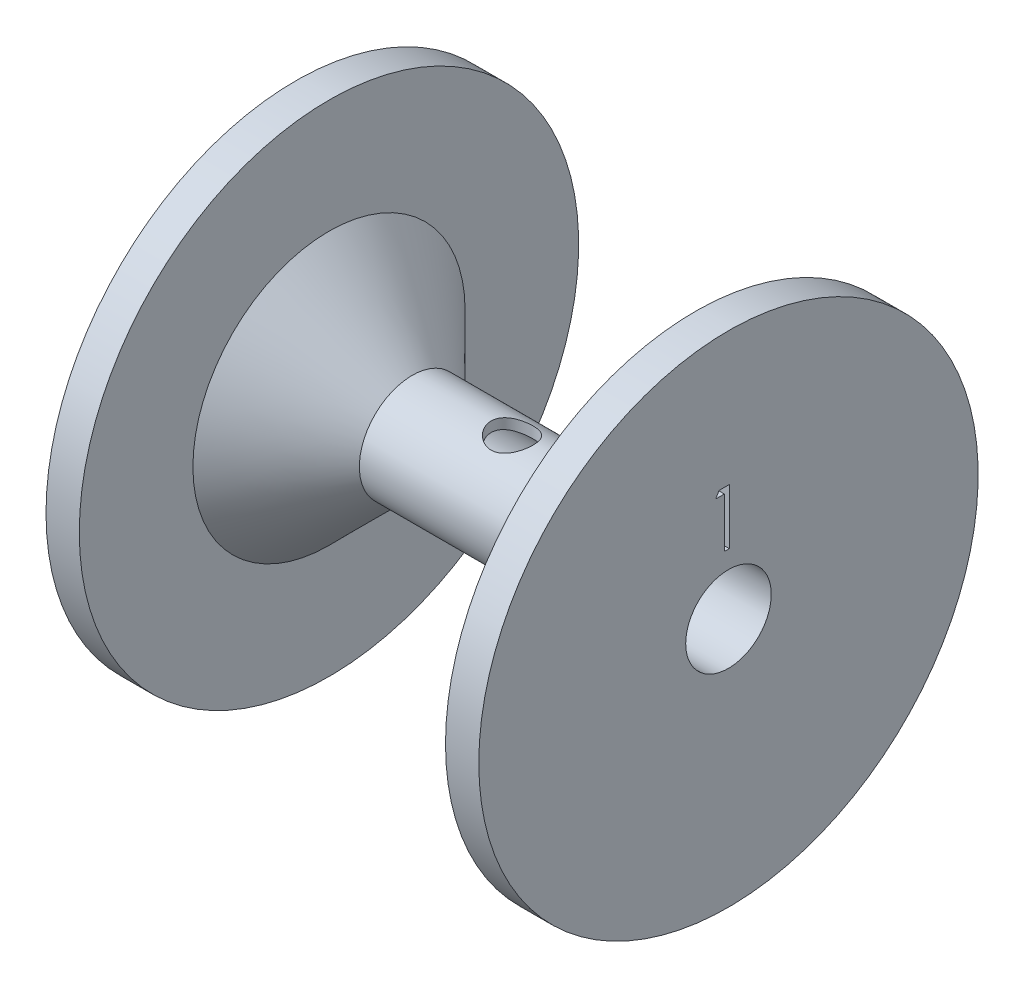
ISO-10303-21;
HEADER;
FILE_DESCRIPTION(('STEP AP214'),'2;1');
FILE_NAME('part.step','',(''),(''),'','','');
FILE_SCHEMA(('AUTOMOTIVE_DESIGN { 1 0 10303 214 1 1 1 1 }'));
ENDSEC;
DATA;
#1=APPLICATION_CONTEXT('core data for automotive mechanical design processes');
#2=APPLICATION_PROTOCOL_DEFINITION('international standard','automotive_design',2000,#1);
#3=PRODUCT_CONTEXT('',#1,'mechanical');
#4=PRODUCT('Part','Part','',(#3));
#5=PRODUCT_RELATED_PRODUCT_CATEGORY('part','',(#4));
#6=PRODUCT_DEFINITION_FORMATION('','',#4);
#7=PRODUCT_DEFINITION_CONTEXT('part definition',#1,'design');
#8=PRODUCT_DEFINITION('design','',#6,#7);
#9=PRODUCT_DEFINITION_SHAPE('','',#8);
#10=(LENGTH_UNIT() NAMED_UNIT(*) SI_UNIT(.MILLI.,.METRE.));
#11=(NAMED_UNIT(*) PLANE_ANGLE_UNIT() SI_UNIT($,.RADIAN.));
#12=(NAMED_UNIT(*) SI_UNIT($,.STERADIAN.) SOLID_ANGLE_UNIT());
#13=UNCERTAINTY_MEASURE_WITH_UNIT(LENGTH_MEASURE(1.E-05),#10,'distance_accuracy_value','');
#14=(GEOMETRIC_REPRESENTATION_CONTEXT(3) GLOBAL_UNCERTAINTY_ASSIGNED_CONTEXT((#13)) GLOBAL_UNIT_ASSIGNED_CONTEXT((#10,
#11,#12)) REPRESENTATION_CONTEXT('',''));
#15=CARTESIAN_POINT('',(0.,0.,0.));
#16=DIRECTION('',(0.,0.,1.));
#17=DIRECTION('',(1.,0.,0.));
#18=AXIS2_PLACEMENT_3D('',#15,#16,#17);
#19=CARTESIAN_POINT('',(16.51,0.,0.));
#20=DIRECTION('',(1.,0.,0.));
#21=DIRECTION('',(0.,0.,-1.));
#22=AXIS2_PLACEMENT_3D('',#19,#20,#21);
#23=PLANE('',#22);
#24=CARTESIAN_POINT('',(16.51,0.,0.));
#25=DIRECTION('',(-1.,0.,0.));
#26=DIRECTION('',(0.,0.,1.));
#27=AXIS2_PLACEMENT_3D('',#24,#25,#26);
#28=CIRCLE('',#27,3.2639);
#29=CARTESIAN_POINT('',(16.51,0.,3.2639));
#30=VERTEX_POINT('',#29);
#31=EDGE_CURVE('E266',#30,#30,#28,.T.);
#32=ORIENTED_EDGE('',*,*,#31,.T.);
#33=EDGE_LOOP('',(#32));
#34=FACE_BOUND('',#33,.T.);
#35=CARTESIAN_POINT('',(16.51,0.,0.));
#36=DIRECTION('',(-1.,0.,0.));
#37=DIRECTION('',(0.,0.,1.));
#38=AXIS2_PLACEMENT_3D('',#35,#36,#37);
#39=CIRCLE('',#38,19.05);
#40=CARTESIAN_POINT('',(16.51,0.,19.05));
#41=VERTEX_POINT('',#40);
#42=EDGE_CURVE('E262',#41,#41,#39,.T.);
#43=ORIENTED_EDGE('',*,*,#42,.F.);
#44=EDGE_LOOP('',(#43));
#45=FACE_BOUND('',#44,.T.);
#46=DIRECTION('',(0.,0.,1.));
#47=VECTOR('',#46,1.);
#48=CARTESIAN_POINT('',(16.51,8.4171758849921,0.317947080590759));
#49=LINE('',#48,#47);
#50=CARTESIAN_POINT('',(16.51,8.4171758849921,0.317947080590759));
#51=VERTEX_POINT('',#50);
#52=CARTESIAN_POINT('',(16.51,8.4171758849921,0.96922913187281));
#53=VERTEX_POINT('',#52);
#54=EDGE_CURVE('E161',#51,#53,#49,.T.);
#55=ORIENTED_EDGE('',*,*,#54,.T.);
#56=DIRECTION('',(0.,0.867930013859708,-0.496686511837686));
#57=VECTOR('',#56,1.);
#58=CARTESIAN_POINT('',(16.51,8.4171758849921,0.96922913187281));
#59=LINE('',#58,#57);
#60=CARTESIAN_POINT('',(16.51,8.85136391918013,0.720758245120673));
#61=VERTEX_POINT('',#60);
#62=EDGE_CURVE('E72',#53,#61,#59,.T.);
#63=ORIENTED_EDGE('',*,*,#62,.T.);
#64=DIRECTION('',(0.,0.,-1.));
#65=VECTOR('',#64,1.);
#66=CARTESIAN_POINT('',(16.51,8.85136391918013,0.720758245120673));
#67=LINE('',#66,#65);
#68=CARTESIAN_POINT('',(16.51,8.85136391918013,-0.0619674493237713));
#69=VERTEX_POINT('',#68);
#70=EDGE_CURVE('E148',#61,#69,#67,.T.);
#71=ORIENTED_EDGE('',*,*,#70,.T.);
#72=DIRECTION('',(0.,-1.,0.));
#73=VECTOR('',#72,1.);
#74=CARTESIAN_POINT('',(16.51,8.85136391918013,-0.0619674493237713));
#75=LINE('',#74,#73);
#76=CARTESIAN_POINT('',(16.51,4.6180305858468,-0.0619674493237713));
#77=VERTEX_POINT('',#76);
#78=EDGE_CURVE('E152',#69,#77,#75,.T.);
#79=ORIENTED_EDGE('',*,*,#78,.T.);
#80=DIRECTION('',(0.,0.,1.));
#81=VECTOR('',#80,1.);
#82=CARTESIAN_POINT('',(16.51,4.6180305858468,-0.0619674493237713));
#83=LINE('',#82,#81);
#84=CARTESIAN_POINT('',(16.51,4.6180305858468,0.317947080590759));
#85=VERTEX_POINT('',#84);
#86=EDGE_CURVE('E156',#77,#85,#83,.T.);
#87=ORIENTED_EDGE('',*,*,#86,.T.);
#88=DIRECTION('',(0.,1.,0.));
#89=VECTOR('',#88,1.);
#90=CARTESIAN_POINT('',(16.51,4.6180305858468,0.317947080590759));
#91=LINE('',#90,#89);
#92=EDGE_CURVE('E134',#85,#51,#91,.T.);
#93=ORIENTED_EDGE('',*,*,#92,.T.);
#94=EDGE_LOOP('',(#55,#63,#71,#79,#87,#93));
#95=FACE_BOUND('',#94,.T.);
#96=ADVANCED_FACE('F55',(#34,#45,#95),#23,.T.);
#97=CARTESIAN_POINT('',(-15.2755244755245,0.,0.));
#98=DIRECTION('',(-1.,0.,0.));
#99=DIRECTION('',(0.,0.,1.));
#100=AXIS2_PLACEMENT_3D('',#97,#98,#99);
#101=CYLINDRICAL_SURFACE('',#100,3.2639);
#102=ORIENTED_EDGE('',*,*,#31,.F.);
#103=EDGE_LOOP('',(#102));
#104=FACE_BOUND('',#103,.T.);
#105=CARTESIAN_POINT('',(-16.51,0.,0.));
#106=DIRECTION('',(-1.,0.,0.));
#107=DIRECTION('',(0.,0.,1.));
#108=AXIS2_PLACEMENT_3D('',#105,#106,#107);
#109=CIRCLE('',#108,3.2639);
#110=CARTESIAN_POINT('',(-16.51,0.,3.2639));
#111=VERTEX_POINT('',#110);
#112=EDGE_CURVE('E272',#111,#111,#109,.T.);
#113=ORIENTED_EDGE('',*,*,#112,.T.);
#114=EDGE_LOOP('',(#113));
#115=FACE_BOUND('',#114,.T.);
#116=CARTESIAN_POINT('',(0.,-2.84482744819435,-1.6));
#117=CARTESIAN_POINT('',(-0.083623499138664,-2.8448342695223,-1.59999441318329));
#118=CARTESIAN_POINT('',(-0.167358257567121,-2.84857022049804,-1.59340074608555));
#119=CARTESIAN_POINT('',(-0.332277918963142,-2.86298026699739,-1.56735293124339));
#120=CARTESIAN_POINT('',(-0.413456849051577,-2.87366950851006,-1.54787070745122));
#121=CARTESIAN_POINT('',(-0.570570471104821,-2.90045229000493,-1.49707434997796));
#122=CARTESIAN_POINT('',(-0.646529847512092,-2.91651792723722,-1.46582120280642));
#123=CARTESIAN_POINT('',(-0.792108532416073,-2.95220026732696,-1.39255589138992));
#124=CARTESIAN_POINT('',(-0.861727713175704,-2.97181704170604,-1.35054351044167));
#125=CARTESIAN_POINT('',(-0.998737033622495,-3.0142899345268,-1.25305240405857));
#126=CARTESIAN_POINT('',(-1.06551509873687,-3.03727954832874,-1.19677127010222));
#127=CARTESIAN_POINT('',(-1.18915738569484,-3.08282836327831,-1.07401097209126));
#128=CARTESIAN_POINT('',(-1.24601682305643,-3.10538735205708,-1.00752691532402));
#129=CARTESIAN_POINT('',(-1.35177524237203,-3.14926588891836,-0.861030578074581));
#130=CARTESIAN_POINT('',(-1.3999291590029,-3.17041297974142,-0.780423923516055));
#131=CARTESIAN_POINT('',(-1.48171517582147,-3.20736460488933,-0.611023504694713));
#132=CARTESIAN_POINT('',(-1.51535609265379,-3.22317238157578,-0.522234750959856));
#133=CARTESIAN_POINT('',(-1.56476303764844,-3.24670429083553,-0.345468531038675));
#134=CARTESIAN_POINT('',(-1.58160015262949,-3.25490999014895,-0.25785598257832));
#135=CARTESIAN_POINT('',(-1.60044066882657,-3.26410501485203,-0.0806941964202339));
#136=CARTESIAN_POINT('',(-1.60245264942398,-3.26509851397403,0.00885389107138366));
#137=CARTESIAN_POINT('',(-1.59201792450603,-3.25999257995499,0.17932594379485));
#138=CARTESIAN_POINT('',(-1.58076685759307,-3.25447964039836,0.260344608343606));
#139=CARTESIAN_POINT('',(-1.5462537127356,-3.23785664846848,0.419171655646575));
#140=CARTESIAN_POINT('',(-1.52299073863865,-3.22674617849106,0.496979798410926));
#141=CARTESIAN_POINT('',(-1.46494110473812,-3.19975438312688,0.648561442663751));
#142=CARTESIAN_POINT('',(-1.42999518779307,-3.18380742413157,0.722261783848476));
#143=CARTESIAN_POINT('',(-1.34978033467947,-3.1485953423221,0.862934749498165));
#144=CARTESIAN_POINT('',(-1.30450766109331,-3.12932901879631,0.929904925536935));
#145=CARTESIAN_POINT('',(-1.2001435529223,-3.08721607310696,1.06177193946253));
#146=CARTESIAN_POINT('',(-1.14016519340273,-3.06420314235618,1.12591436760964));
#147=CARTESIAN_POINT('',(-1.0104782548371,-3.01834896110929,1.24362836631155));
#148=CARTESIAN_POINT('',(-0.940762752686837,-2.99550784505849,1.29719234960488));
#149=CARTESIAN_POINT('',(-0.788507504496123,-2.9511325400457,1.39532523894429));
#150=CARTESIAN_POINT('',(-0.705452684806755,-2.92975595217677,1.43917322150325));
#151=CARTESIAN_POINT('',(-0.5318452132984,-2.89287909178528,1.51194418576262));
#152=CARTESIAN_POINT('',(-0.441300235269691,-2.87737289362117,1.54088222844564));
#153=CARTESIAN_POINT('',(-0.262746683672955,-2.85567179353279,1.58071570942484));
#154=CARTESIAN_POINT('',(-0.175092947916233,-2.84884388031478,1.59284451184167));
#155=CARTESIAN_POINT('',(0.00124327330281139,-2.84346641718288,1.60242954623906));
#156=CARTESIAN_POINT('',(0.0899250573523626,-2.84491152040463,1.59989525499028));
#157=CARTESIAN_POINT('',(0.256062419611413,-2.85524687789842,1.58135797536729));
#158=CARTESIAN_POINT('',(0.333732502837263,-2.8633538867718,1.56677107119405));
#159=CARTESIAN_POINT('',(0.485386449321157,-2.88496140542308,1.52661609243556));
#160=CARTESIAN_POINT('',(0.559369166820428,-2.89846358000973,1.50104462811591));
#161=CARTESIAN_POINT('',(0.705445176260552,-2.93007969501031,1.43838695649461));
#162=CARTESIAN_POINT('',(0.77729123939743,-2.948378658183,1.40082122967303));
#163=CARTESIAN_POINT('',(0.91406951821553,-2.98734994448669,1.31566525000639));
#164=CARTESIAN_POINT('',(0.97899818131534,-3.00802347591109,1.2680698832303));
#165=CARTESIAN_POINT('',(1.10825978137467,-3.05240311451509,1.15751181124395));
#166=CARTESIAN_POINT('',(1.17158292177403,-3.07617503353202,1.09338958789327));
#167=CARTESIAN_POINT('',(1.28687037087404,-3.12190252599595,0.955026241019953));
#168=CARTESIAN_POINT('',(1.33883130562101,-3.14385755872744,0.880782122444283));
#169=CARTESIAN_POINT('',(1.43088068084771,-3.18413393603829,0.721934132361658));
#170=CARTESIAN_POINT('',(1.47067408566852,-3.20236188770027,0.637133963852066));
#171=CARTESIAN_POINT('',(1.53504307620828,-3.23242703751139,0.46089352809846));
#172=CARTESIAN_POINT('',(1.55963150843198,-3.24426962949026,0.369458939388968));
#173=CARTESIAN_POINT('',(1.59085060068606,-3.2593991830478,0.191373685284252));
#174=CARTESIAN_POINT('',(1.5988904817121,-3.2633565176327,0.105026384625684));
#175=CARTESIAN_POINT('',(1.60089366265059,-3.26433767037618,-0.0678587391189147));
#176=CARTESIAN_POINT('',(1.594861509611,-3.26136372821467,-0.154396491637526));
#177=CARTESIAN_POINT('',(1.56984422284176,-3.2492072151941,-0.319591735355735));
#178=CARTESIAN_POINT('',(1.551681859293,-3.24041932984983,-0.398405874682274));
#179=CARTESIAN_POINT('',(1.50400125090324,-3.21786001611158,-0.551752391652025));
#180=CARTESIAN_POINT('',(1.4744813155614,-3.20408784585726,-0.626284129988671));
#181=CARTESIAN_POINT('',(1.40356039693267,-3.17206265217066,-0.772604096876724));
#182=CARTESIAN_POINT('',(1.3616958877158,-3.15363987009113,-0.844129406148341));
#183=CARTESIAN_POINT('',(1.2678638021161,-3.11427501483732,-0.979442869340341));
#184=CARTESIAN_POINT('',(1.21589157365114,-3.09333178332351,-1.04322743854481));
#185=CARTESIAN_POINT('',(1.09752023763263,-3.04865662688505,-1.1676971886554));
#186=CARTESIAN_POINT('',(1.03021492045698,-3.02485005716613,-1.22749628095013));
#187=CARTESIAN_POINT('',(0.886112272234853,-2.97885569527048,-1.33525421263384));
#188=CARTESIAN_POINT('',(0.809307167767135,-2.95666925272412,-1.3832032579787));
#189=CARTESIAN_POINT('',(0.645687994610532,-2.91607967865566,-1.46688350811489));
#190=CARTESIAN_POINT('',(0.55866676209542,-2.89778897129234,-1.50226743703945));
#191=CARTESIAN_POINT('',(0.378775305096976,-2.86857642856792,-1.55734082636999));
#192=CARTESIAN_POINT('',(0.285925829484082,-2.85762991213687,-1.57708289409386));
#193=CARTESIAN_POINT('',(0.160113681975538,-2.84915005362684,-1.59229317398436));
#194=CARTESIAN_POINT('',(0.1281869540092,-2.84753426902776,-1.59517912280555));
#195=CARTESIAN_POINT('',(0.0641789543950112,-2.84537162336486,-1.59903366867308));
#196=CARTESIAN_POINT('',(0.0320976730987082,-2.84482482992608,-1.60000214441895));
#197=CARTESIAN_POINT('',(0.,-2.84482744819435,-1.6));
#198=B_SPLINE_CURVE_WITH_KNOTS('',3,(#116,#117,#118,#119,#120,#121,#122,#123,#124,#125,#126,
#127,#128,#129,#130,#131,#132,#133,#134,#135,#136,#137,#138,#139,#140,#141,#142,#143,#144,#145,
#146,#147,#148,#149,#150,#151,#152,#153,#154,#155,#156,#157,#158,#159,#160,#161,#162,#163,#164,
#165,#166,#167,#168,#169,#170,#171,#172,#173,#174,#175,#176,#177,#178,#179,#180,#181,#182,#183,
#184,#185,#186,#187,#188,#189,#190,#191,#192,#193,#194,#195,#196,#197),.UNSPECIFIED.,.T.,.F.,(4,
2,2,2,2,2,2,2,2,2,2,2,2,2,2,2,2,2,2,2,2,2,2,2,2,2,2,2,2,2,2,2,2,2,2,2,2,2,2,2,4),(0.,
0.250735527018794,0.502019055317263,0.752018175395687,1.00202233113827,1.27180490085683,
1.54171724879492,1.82895177797751,2.11601156567413,2.38331011515569,2.65045396543692,
2.8952465415389,3.14005738311403,3.38835156022762,3.63673574193721,3.90791646660658,
4.17929099157197,4.46674313847297,4.75390434915126,5.01862239376756,5.28316936999172,
5.52043166415189,5.75776722793461,6.00612268590363,6.2546050835408,6.53295657354421,
6.81139060681067,7.09612072866068,7.38060995547354,7.63965922106082,7.89862479254484,
8.14160070238966,8.384612791621,8.63826275206819,8.89202973248046,9.17017006080567,
9.44853950858405,9.73409351745884,10.0186830142202,10.1149181393811,10.2111593522384),.UNSPECIFIED.);
#199=CARTESIAN_POINT('',(0.,-2.84482744819435,-1.6));
#200=VERTEX_POINT('',#199);
#201=EDGE_CURVE('E179',#200,#200,#198,.T.);
#202=ORIENTED_EDGE('',*,*,#201,.F.);
#203=EDGE_LOOP('',(#202));
#204=FACE_BOUND('',#203,.T.);
#205=CARTESIAN_POINT('',(0.,2.84482744819435,-1.6));
#206=CARTESIAN_POINT('',(0.083623499138664,2.8448342695223,-1.59999441318329));
#207=CARTESIAN_POINT('',(0.167358257567121,2.84857022049804,-1.59340074608555));
#208=CARTESIAN_POINT('',(0.332277918963142,2.86298026699739,-1.56735293124339));
#209=CARTESIAN_POINT('',(0.413456849051577,2.87366950851006,-1.54787070745122));
#210=CARTESIAN_POINT('',(0.570570471104821,2.90045229000493,-1.49707434997796));
#211=CARTESIAN_POINT('',(0.646529847512092,2.91651792723722,-1.46582120280642));
#212=CARTESIAN_POINT('',(0.792108532416073,2.95220026732696,-1.39255589138992));
#213=CARTESIAN_POINT('',(0.861727713175704,2.97181704170604,-1.35054351044167));
#214=CARTESIAN_POINT('',(0.998737033622495,3.0142899345268,-1.25305240405857));
#215=CARTESIAN_POINT('',(1.06551509873687,3.03727954832874,-1.19677127010222));
#216=CARTESIAN_POINT('',(1.18915738569484,3.08282836327831,-1.07401097209126));
#217=CARTESIAN_POINT('',(1.24601682305643,3.10538735205708,-1.00752691532402));
#218=CARTESIAN_POINT('',(1.35177524237203,3.14926588891836,-0.861030578074581));
#219=CARTESIAN_POINT('',(1.3999291590029,3.17041297974142,-0.780423923516055));
#220=CARTESIAN_POINT('',(1.48171517582147,3.20736460488933,-0.611023504694713));
#221=CARTESIAN_POINT('',(1.51535609265379,3.22317238157578,-0.522234750959856));
#222=CARTESIAN_POINT('',(1.56476303764844,3.24670429083553,-0.345468531038675));
#223=CARTESIAN_POINT('',(1.58160015262949,3.25490999014895,-0.25785598257832));
#224=CARTESIAN_POINT('',(1.60044066882657,3.26410501485203,-0.0806941964202339));
#225=CARTESIAN_POINT('',(1.60245264942398,3.26509851397403,0.00885389107138366));
#226=CARTESIAN_POINT('',(1.59201792450603,3.25999257995499,0.17932594379485));
#227=CARTESIAN_POINT('',(1.58076685759307,3.25447964039836,0.260344608343606));
#228=CARTESIAN_POINT('',(1.5462537127356,3.23785664846848,0.419171655646575));
#229=CARTESIAN_POINT('',(1.52299073863865,3.22674617849106,0.496979798410926));
#230=CARTESIAN_POINT('',(1.46494110473812,3.19975438312688,0.648561442663751));
#231=CARTESIAN_POINT('',(1.42999518779307,3.18380742413157,0.722261783848476));
#232=CARTESIAN_POINT('',(1.34978033467947,3.1485953423221,0.862934749498165));
#233=CARTESIAN_POINT('',(1.30450766109331,3.12932901879631,0.929904925536935));
#234=CARTESIAN_POINT('',(1.2001435529223,3.08721607310696,1.06177193946253));
#235=CARTESIAN_POINT('',(1.14016519340273,3.06420314235618,1.12591436760964));
#236=CARTESIAN_POINT('',(1.0104782548371,3.01834896110929,1.24362836631155));
#237=CARTESIAN_POINT('',(0.940762752686837,2.99550784505849,1.29719234960488));
#238=CARTESIAN_POINT('',(0.788507504496123,2.9511325400457,1.39532523894429));
#239=CARTESIAN_POINT('',(0.705452684806755,2.92975595217677,1.43917322150325));
#240=CARTESIAN_POINT('',(0.5318452132984,2.89287909178528,1.51194418576262));
#241=CARTESIAN_POINT('',(0.441300235269691,2.87737289362117,1.54088222844564));
#242=CARTESIAN_POINT('',(0.262746683672955,2.85567179353279,1.58071570942484));
#243=CARTESIAN_POINT('',(0.175092947916233,2.84884388031478,1.59284451184167));
#244=CARTESIAN_POINT('',(-0.00124327330281139,2.84346641718288,1.60242954623906));
#245=CARTESIAN_POINT('',(-0.0899250573523626,2.84491152040463,1.59989525499028));
#246=CARTESIAN_POINT('',(-0.256062419611413,2.85524687789842,1.58135797536729));
#247=CARTESIAN_POINT('',(-0.333732502837263,2.8633538867718,1.56677107119405));
#248=CARTESIAN_POINT('',(-0.485386449321157,2.88496140542308,1.52661609243556));
#249=CARTESIAN_POINT('',(-0.559369166820428,2.89846358000973,1.50104462811591));
#250=CARTESIAN_POINT('',(-0.705445176260552,2.93007969501031,1.43838695649461));
#251=CARTESIAN_POINT('',(-0.77729123939743,2.948378658183,1.40082122967303));
#252=CARTESIAN_POINT('',(-0.91406951821553,2.98734994448669,1.31566525000639));
#253=CARTESIAN_POINT('',(-0.97899818131534,3.00802347591109,1.2680698832303));
#254=CARTESIAN_POINT('',(-1.10825978137467,3.05240311451509,1.15751181124395));
#255=CARTESIAN_POINT('',(-1.17158292177403,3.07617503353202,1.09338958789327));
#256=CARTESIAN_POINT('',(-1.28687037087404,3.12190252599595,0.955026241019953));
#257=CARTESIAN_POINT('',(-1.33883130562101,3.14385755872744,0.880782122444283));
#258=CARTESIAN_POINT('',(-1.43088068084771,3.18413393603829,0.721934132361658));
#259=CARTESIAN_POINT('',(-1.47067408566852,3.20236188770027,0.637133963852066));
#260=CARTESIAN_POINT('',(-1.53504307620828,3.23242703751139,0.46089352809846));
#261=CARTESIAN_POINT('',(-1.55963150843198,3.24426962949026,0.369458939388968));
#262=CARTESIAN_POINT('',(-1.59085060068606,3.2593991830478,0.191373685284252));
#263=CARTESIAN_POINT('',(-1.5988904817121,3.2633565176327,0.105026384625684));
#264=CARTESIAN_POINT('',(-1.60089366265059,3.26433767037618,-0.0678587391189147));
#265=CARTESIAN_POINT('',(-1.594861509611,3.26136372821467,-0.154396491637526));
#266=CARTESIAN_POINT('',(-1.56984422284176,3.2492072151941,-0.319591735355735));
#267=CARTESIAN_POINT('',(-1.551681859293,3.24041932984983,-0.398405874682274));
#268=CARTESIAN_POINT('',(-1.50400125090324,3.21786001611158,-0.551752391652025));
#269=CARTESIAN_POINT('',(-1.4744813155614,3.20408784585726,-0.626284129988671));
#270=CARTESIAN_POINT('',(-1.40356039693267,3.17206265217066,-0.772604096876724));
#271=CARTESIAN_POINT('',(-1.3616958877158,3.15363987009113,-0.844129406148341));
#272=CARTESIAN_POINT('',(-1.2678638021161,3.11427501483732,-0.979442869340341));
#273=CARTESIAN_POINT('',(-1.21589157365114,3.09333178332351,-1.04322743854481));
#274=CARTESIAN_POINT('',(-1.09752023763263,3.04865662688505,-1.1676971886554));
#275=CARTESIAN_POINT('',(-1.03021492045698,3.02485005716613,-1.22749628095013));
#276=CARTESIAN_POINT('',(-0.886112272234853,2.97885569527048,-1.33525421263384));
#277=CARTESIAN_POINT('',(-0.809307167767135,2.95666925272412,-1.3832032579787));
#278=CARTESIAN_POINT('',(-0.645687994610532,2.91607967865566,-1.46688350811489));
#279=CARTESIAN_POINT('',(-0.55866676209542,2.89778897129234,-1.50226743703945));
#280=CARTESIAN_POINT('',(-0.378775305096976,2.86857642856792,-1.55734082636999));
#281=CARTESIAN_POINT('',(-0.285925829484082,2.85762991213687,-1.57708289409386));
#282=CARTESIAN_POINT('',(-0.160113681975538,2.84915005362684,-1.59229317398436));
#283=CARTESIAN_POINT('',(-0.1281869540092,2.84753426902776,-1.59517912280555));
#284=CARTESIAN_POINT('',(-0.0641789543950112,2.84537162336486,-1.59903366867308));
#285=CARTESIAN_POINT('',(-0.0320976730987082,2.84482482992608,-1.60000214441895));
#286=CARTESIAN_POINT('',(0.,2.84482744819435,-1.6));
#287=B_SPLINE_CURVE_WITH_KNOTS('',3,(#205,#206,#207,#208,#209,#210,#211,#212,#213,#214,#215,
#216,#217,#218,#219,#220,#221,#222,#223,#224,#225,#226,#227,#228,#229,#230,#231,#232,#233,#234,
#235,#236,#237,#238,#239,#240,#241,#242,#243,#244,#245,#246,#247,#248,#249,#250,#251,#252,#253,
#254,#255,#256,#257,#258,#259,#260,#261,#262,#263,#264,#265,#266,#267,#268,#269,#270,#271,#272,
#273,#274,#275,#276,#277,#278,#279,#280,#281,#282,#283,#284,#285,#286),.UNSPECIFIED.,.T.,.F.,(4,
2,2,2,2,2,2,2,2,2,2,2,2,2,2,2,2,2,2,2,2,2,2,2,2,2,2,2,2,2,2,2,2,2,2,2,2,2,2,2,4),(0.,
0.250735527018794,0.502019055317263,0.752018175395687,1.00202233113827,1.27180490085683,
1.54171724879492,1.82895177797751,2.11601156567413,2.38331011515569,2.65045396543692,
2.8952465415389,3.14005738311403,3.38835156022762,3.63673574193721,3.90791646660658,
4.17929099157197,4.46674313847297,4.75390434915126,5.01862239376756,5.28316936999172,
5.52043166415189,5.75776722793461,6.00612268590363,6.2546050835408,6.53295657354421,
6.81139060681067,7.09612072866068,7.38060995547354,7.63965922106082,7.89862479254484,
8.14160070238966,8.384612791621,8.63826275206819,8.89202973248046,9.17017006080567,
9.44853950858405,9.73409351745884,10.0186830142202,10.1149181393811,10.2111593522384),.UNSPECIFIED.);
#288=CARTESIAN_POINT('',(0.,2.84482744819435,-1.6));
#289=VERTEX_POINT('',#288);
#290=EDGE_CURVE('E188',#289,#289,#287,.T.);
#291=ORIENTED_EDGE('',*,*,#290,.F.);
#292=EDGE_LOOP('',(#291));
#293=FACE_BOUND('',#292,.T.);
#294=ADVANCED_FACE('F194',(#104,#115,#204,#293),#101,.F.);
#295=CARTESIAN_POINT('',(-15.2755244755245,0.,0.));
#296=DIRECTION('',(-1.,0.,0.));
#297=DIRECTION('',(0.,0.,1.));
#298=AXIS2_PLACEMENT_3D('',#295,#296,#297);
#299=CYLINDRICAL_SURFACE('',#298,4.03225);
#300=CARTESIAN_POINT('',(7.61999999999995,0.,0.));
#301=DIRECTION('',(1.,0.,0.));
#302=DIRECTION('',(0.,0.,-1.));
#303=AXIS2_PLACEMENT_3D('',#300,#301,#302);
#304=CIRCLE('',#303,4.03225);
#305=CARTESIAN_POINT('',(7.61999999999995,0.,-4.03225));
#306=VERTEX_POINT('',#305);
#307=EDGE_CURVE('E230',#306,#306,#304,.F.);
#308=ORIENTED_EDGE('',*,*,#307,.T.);
#309=EDGE_LOOP('',(#308));
#310=FACE_BOUND('',#309,.T.);
#311=CARTESIAN_POINT('',(-7.62000000000003,0.,0.));
#312=DIRECTION('',(1.,0.,0.));
#313=DIRECTION('',(0.,0.,-1.));
#314=AXIS2_PLACEMENT_3D('',#311,#312,#313);
#315=CIRCLE('',#314,4.03225);
#316=CARTESIAN_POINT('',(-7.62000000000003,0.,-4.03225));
#317=VERTEX_POINT('',#316);
#318=EDGE_CURVE('E226',#317,#317,#315,.T.);
#319=ORIENTED_EDGE('',*,*,#318,.T.);
#320=EDGE_LOOP('',(#319));
#321=FACE_BOUND('',#320,.T.);
#322=CARTESIAN_POINT('',(0.,-3.70122142846115,-1.6));
#323=CARTESIAN_POINT('',(-0.0857746308583699,-3.70122992043839,-1.59999072320159));
#324=CARTESIAN_POINT('',(-0.171674124850804,-3.70424517589615,-1.59306155771875));
#325=CARTESIAN_POINT('',(-0.341012807703136,-3.71593055680137,-1.56560149304544));
#326=CARTESIAN_POINT('',(-0.424445067394975,-3.72461527077333,-1.54503550172497));
#327=CARTESIAN_POINT('',(-0.586114135697187,-3.74648840217128,-1.49120727801159));
#328=CARTESIAN_POINT('',(-0.664369060269839,-3.75966000209152,-1.45799240144883));
#329=CARTESIAN_POINT('',(-0.814176884274445,-3.78899937378558,-1.37994732432217));
#330=CARTESIAN_POINT('',(-0.88573132118237,-3.80516645567561,-1.33511979730137));
#331=CARTESIAN_POINT('',(-1.02417505321281,-3.8396939760474,-1.23242297260378));
#332=CARTESIAN_POINT('',(-1.09064012808509,-3.85812423354445,-1.17400501012897));
#333=CARTESIAN_POINT('',(-1.21313916268767,-3.8945242988141,-1.04694095530087));
#334=CARTESIAN_POINT('',(-1.26916950728423,-3.91249394515453,-0.978291332942291));
#335=CARTESIAN_POINT('',(-1.37130303557594,-3.94678412745002,-0.829446508867174));
#336=CARTESIAN_POINT('',(-1.41693808215103,-3.96301392136853,-0.748907291647473));
#337=CARTESIAN_POINT('',(-1.49383160054317,-3.99115105065323,-0.580536148875601));
#338=CARTESIAN_POINT('',(-1.52509583436857,-4.00306011801979,-0.492707162876974));
#339=CARTESIAN_POINT('',(-1.57085082753972,-4.02071984884761,-0.316696347944861));
#340=CARTESIAN_POINT('',(-1.58607090307551,-4.02673730147783,-0.228731411922683));
#341=CARTESIAN_POINT('',(-1.6016524471619,-4.03289919222636,-0.0513040274825971));
#342=CARTESIAN_POINT('',(-1.60201936591769,-4.03304578459312,0.038157859590158));
#343=CARTESIAN_POINT('',(-1.58828730176276,-4.02761275667629,0.210773641666378));
#344=CARTESIAN_POINT('',(-1.57498702009987,-4.02234929183004,0.294002821187449));
#345=CARTESIAN_POINT('',(-1.53565466215674,-4.00711220482217,0.456935475167889));
#346=CARTESIAN_POINT('',(-1.50962165289254,-3.99713823750279,0.536638690797352));
#347=CARTESIAN_POINT('',(-1.44524179034886,-3.97326815808076,0.691686870702852));
#348=CARTESIAN_POINT('',(-1.40671585138641,-3.95931538398564,0.766948390153693));
#349=CARTESIAN_POINT('',(-1.31861024281384,-3.92887595318072,0.910131716484234));
#350=CARTESIAN_POINT('',(-1.2690268107644,-3.91238843458947,0.978051013381039));
#351=CARTESIAN_POINT('',(-1.15647144049853,-3.87729648613936,1.10928879571283));
#352=CARTESIAN_POINT('',(-1.09284060241639,-3.85862411090835,1.17202486159269));
#353=CARTESIAN_POINT('',(-0.955883093884847,-3.82209389191249,1.28617187950731));
#354=CARTESIAN_POINT('',(-0.882553363426708,-3.80423630761634,1.33757924362297));
#355=CARTESIAN_POINT('',(-0.725716113276124,-3.77089982059187,1.42891222411315));
#356=CARTESIAN_POINT('',(-0.641984686291775,-3.75549954896498,1.46848443959007));
#357=CARTESIAN_POINT('',(-0.468272673350789,-3.72974137236196,1.53273674706354));
#358=CARTESIAN_POINT('',(-0.378296110325662,-3.71938025513436,1.55742632853046));
#359=CARTESIAN_POINT('',(-0.200451531052416,-3.70565027905274,1.5898078059542));
#360=CARTESIAN_POINT('',(-0.112783952636763,-3.70189718503995,1.59843556246671));
#361=CARTESIAN_POINT('',(0.0628075362133973,-3.70071437353128,1.60117415763542));
#362=CARTESIAN_POINT('',(0.150731363150173,-3.70328278582672,1.59528928982998));
#363=CARTESIAN_POINT('',(0.319195645699295,-3.71405977604728,1.57002135591296));
#364=CARTESIAN_POINT('',(0.399874647852606,-3.72194641416546,1.55140795322356));
#365=CARTESIAN_POINT('',(0.556913145717102,-3.74207416030019,1.50220582714464));
#366=CARTESIAN_POINT('',(0.63327168899656,-3.75431622415546,1.47161447493432));
#367=CARTESIAN_POINT('',(0.782922199418481,-3.78237776698882,1.3979509655245));
#368=CARTESIAN_POINT('',(0.855967644807707,-3.79832123126349,1.35442668347132));
#369=CARTESIAN_POINT('',(0.994046719294681,-3.83179760072246,1.25659741771409));
#370=CARTESIAN_POINT('',(1.05907710959868,-3.84933114350432,1.20228809889448));
#371=CARTESIAN_POINT('',(1.18417736039819,-3.88554653673025,1.07978254040327));
#372=CARTESIAN_POINT('',(1.24354621279963,-3.90421952202163,1.01086514887062));
#373=CARTESIAN_POINT('',(1.3499817970392,-3.93941151133192,0.863598097535779));
#374=CARTESIAN_POINT('',(1.3970480956192,-3.95593043948129,0.785248105688295));
#375=CARTESIAN_POINT('',(1.47734830836096,-3.98499614009713,0.621110782994502));
#376=CARTESIAN_POINT('',(1.51059208573788,-3.9975457433844,0.535328808321518));
#377=CARTESIAN_POINT('',(1.56196162483295,-4.01723725830163,0.358770574845803));
#378=CARTESIAN_POINT('',(1.58009544545271,-4.02438205240116,0.267997005887731));
#379=CARTESIAN_POINT('',(1.59978433932759,-4.03215534845777,0.0903315295815041));
#380=CARTESIAN_POINT('',(1.60233115378312,-4.03317358367111,0.00356571790202806));
#381=CARTESIAN_POINT('',(1.5933837939936,-4.02962706360898,-0.169113213765652));
#382=CARTESIAN_POINT('',(1.58189168686977,-4.02506313026397,-0.255026457410244));
#383=CARTESIAN_POINT('',(1.54590026252348,-4.01105796014076,-0.420934941365435));
#384=CARTESIAN_POINT('',(1.52179952683685,-4.00176640624068,-0.501030287852593));
#385=CARTESIAN_POINT('',(1.46169074961204,-3.97929708687236,-0.656028816855521));
#386=CARTESIAN_POINT('',(1.42568049510806,-3.96611859920326,-0.73093103127883));
#387=CARTESIAN_POINT('',(1.34098902586267,-3.93645172656388,-0.877034474098165));
#388=CARTESIAN_POINT('',(1.29182038213284,-3.91984330507516,-0.947928257042134));
#389=CARTESIAN_POINT('',(1.18294163759038,-3.88532211962555,-1.08075430802393));
#390=CARTESIAN_POINT('',(1.12322727337379,-3.86740882986235,-1.14268293314873));
#391=CARTESIAN_POINT('',(0.990666771711586,-3.83094778794564,-1.25970733544145));
#392=CARTESIAN_POINT('',(0.917243511753679,-3.81242753596082,-1.31416008365713));
#393=CARTESIAN_POINT('',(0.761707124732459,-3.77802933424481,-1.41001405877398));
#394=CARTESIAN_POINT('',(0.679592920582749,-3.76215171264893,-1.45141366543702));
#395=CARTESIAN_POINT('',(0.516425996198443,-3.73628587558595,-1.51668407503868));
#396=CARTESIAN_POINT('',(0.435927732219542,-3.72589960862546,-1.54178589096372));
#397=CARTESIAN_POINT('',(0.271645046742613,-3.71028349890633,-1.57900582740005));
#398=CARTESIAN_POINT('',(0.187870518937096,-3.70503921592848,-1.59116031620946));
#399=CARTESIAN_POINT('',(0.0691833355472793,-3.70170388203552,-1.59888137808806));
#400=CARTESIAN_POINT('',(0.0346018275604611,-3.70121800276373,-1.60000374229741));
#401=CARTESIAN_POINT('',(0.,-3.70122142846115,-1.6));
#402=B_SPLINE_CURVE_WITH_KNOTS('',3,(#322,#323,#324,#325,#326,#327,#328,#329,#330,#331,#332,
#333,#334,#335,#336,#337,#338,#339,#340,#341,#342,#343,#344,#345,#346,#347,#348,#349,#350,#351,
#352,#353,#354,#355,#356,#357,#358,#359,#360,#361,#362,#363,#364,#365,#366,#367,#368,#369,#370,
#371,#372,#373,#374,#375,#376,#377,#378,#379,#380,#381,#382,#383,#384,#385,#386,#387,#388,#389,
#390,#391,#392,#393,#394,#395,#396,#397,#398,#399,#400,#401),.UNSPECIFIED.,.T.,.F.,(4,2,2,2,2,2,
2,2,2,2,2,2,2,2,2,2,2,2,2,2,2,2,2,2,2,2,2,2,2,2,2,2,2,2,2,2,2,2,2,4),(0.,0.257217651808282,
0.515099793177277,0.772025799870432,1.02889270780544,1.2988637981976,1.56892824733424,
1.84944494620814,2.1298490729866,2.39687067075105,2.6637942869405,2.9159596370028,
3.16814346711775,3.42411520339912,3.68017417026384,3.95280838877036,4.22552882970418,
4.5057257474754,4.78574381648407,5.04886334006765,5.31190502947007,5.56030354781339,
5.80875661318438,6.06719336010698,6.32573419839218,6.603011227645,6.88029802042717,
7.15738661113178,7.43432732175584,7.69344710074884,7.95252873098237,8.20387532548269,
8.45526865018492,8.71771329766244,8.98026428967079,9.25875395050622,9.53727816563541,
9.7910445329803,10.0440961901853,10.1478588149184),.UNSPECIFIED.);
#403=CARTESIAN_POINT('',(0.,-3.70122142846115,-1.6));
#404=VERTEX_POINT('',#403);
#405=EDGE_CURVE('E178',#404,#404,#402,.T.);
#406=ORIENTED_EDGE('',*,*,#405,.T.);
#407=EDGE_LOOP('',(#406));
#408=FACE_BOUND('',#407,.T.);
#409=CARTESIAN_POINT('',(0.,3.70122142846115,-1.6));
#410=CARTESIAN_POINT('',(0.0857746308583699,3.70122992043839,-1.59999072320159));
#411=CARTESIAN_POINT('',(0.171674124850804,3.70424517589615,-1.59306155771875));
#412=CARTESIAN_POINT('',(0.341012807703136,3.71593055680137,-1.56560149304544));
#413=CARTESIAN_POINT('',(0.424445067394975,3.72461527077333,-1.54503550172497));
#414=CARTESIAN_POINT('',(0.586114135697187,3.74648840217128,-1.49120727801159));
#415=CARTESIAN_POINT('',(0.664369060269839,3.75966000209152,-1.45799240144883));
#416=CARTESIAN_POINT('',(0.814176884274445,3.78899937378558,-1.37994732432217));
#417=CARTESIAN_POINT('',(0.88573132118237,3.80516645567561,-1.33511979730137));
#418=CARTESIAN_POINT('',(1.02417505321281,3.8396939760474,-1.23242297260378));
#419=CARTESIAN_POINT('',(1.09064012808509,3.85812423354445,-1.17400501012897));
#420=CARTESIAN_POINT('',(1.21313916268767,3.8945242988141,-1.04694095530087));
#421=CARTESIAN_POINT('',(1.26916950728423,3.91249394515453,-0.978291332942291));
#422=CARTESIAN_POINT('',(1.37130303557594,3.94678412745002,-0.829446508867174));
#423=CARTESIAN_POINT('',(1.41693808215103,3.96301392136853,-0.748907291647473));
#424=CARTESIAN_POINT('',(1.49383160054317,3.99115105065323,-0.580536148875601));
#425=CARTESIAN_POINT('',(1.52509583436857,4.00306011801979,-0.492707162876974));
#426=CARTESIAN_POINT('',(1.57085082753972,4.02071984884761,-0.316696347944861));
#427=CARTESIAN_POINT('',(1.58607090307551,4.02673730147783,-0.228731411922683));
#428=CARTESIAN_POINT('',(1.6016524471619,4.03289919222636,-0.0513040274825971));
#429=CARTESIAN_POINT('',(1.60201936591769,4.03304578459312,0.038157859590158));
#430=CARTESIAN_POINT('',(1.58828730176276,4.02761275667629,0.210773641666378));
#431=CARTESIAN_POINT('',(1.57498702009987,4.02234929183004,0.294002821187449));
#432=CARTESIAN_POINT('',(1.53565466215674,4.00711220482217,0.456935475167889));
#433=CARTESIAN_POINT('',(1.50962165289254,3.99713823750279,0.536638690797352));
#434=CARTESIAN_POINT('',(1.44524179034886,3.97326815808076,0.691686870702852));
#435=CARTESIAN_POINT('',(1.40671585138641,3.95931538398564,0.766948390153693));
#436=CARTESIAN_POINT('',(1.31861024281384,3.92887595318072,0.910131716484234));
#437=CARTESIAN_POINT('',(1.2690268107644,3.91238843458947,0.978051013381039));
#438=CARTESIAN_POINT('',(1.15647144049853,3.87729648613936,1.10928879571283));
#439=CARTESIAN_POINT('',(1.09284060241639,3.85862411090835,1.17202486159269));
#440=CARTESIAN_POINT('',(0.955883093884847,3.82209389191249,1.28617187950731));
#441=CARTESIAN_POINT('',(0.882553363426708,3.80423630761634,1.33757924362297));
#442=CARTESIAN_POINT('',(0.725716113276124,3.77089982059187,1.42891222411315));
#443=CARTESIAN_POINT('',(0.641984686291775,3.75549954896498,1.46848443959007));
#444=CARTESIAN_POINT('',(0.468272673350789,3.72974137236196,1.53273674706354));
#445=CARTESIAN_POINT('',(0.378296110325662,3.71938025513436,1.55742632853046));
#446=CARTESIAN_POINT('',(0.200451531052416,3.70565027905274,1.5898078059542));
#447=CARTESIAN_POINT('',(0.112783952636763,3.70189718503995,1.59843556246671));
#448=CARTESIAN_POINT('',(-0.0628075362133973,3.70071437353128,1.60117415763542));
#449=CARTESIAN_POINT('',(-0.150731363150173,3.70328278582672,1.59528928982998));
#450=CARTESIAN_POINT('',(-0.319195645699295,3.71405977604728,1.57002135591296));
#451=CARTESIAN_POINT('',(-0.399874647852606,3.72194641416546,1.55140795322356));
#452=CARTESIAN_POINT('',(-0.556913145717102,3.74207416030019,1.50220582714464));
#453=CARTESIAN_POINT('',(-0.63327168899656,3.75431622415546,1.47161447493432));
#454=CARTESIAN_POINT('',(-0.782922199418481,3.78237776698882,1.3979509655245));
#455=CARTESIAN_POINT('',(-0.855967644807707,3.79832123126349,1.35442668347132));
#456=CARTESIAN_POINT('',(-0.994046719294681,3.83179760072246,1.25659741771409));
#457=CARTESIAN_POINT('',(-1.05907710959868,3.84933114350432,1.20228809889448));
#458=CARTESIAN_POINT('',(-1.18417736039819,3.88554653673025,1.07978254040327));
#459=CARTESIAN_POINT('',(-1.24354621279963,3.90421952202163,1.01086514887062));
#460=CARTESIAN_POINT('',(-1.3499817970392,3.93941151133192,0.863598097535779));
#461=CARTESIAN_POINT('',(-1.3970480956192,3.95593043948129,0.785248105688295));
#462=CARTESIAN_POINT('',(-1.47734830836096,3.98499614009713,0.621110782994502));
#463=CARTESIAN_POINT('',(-1.51059208573788,3.9975457433844,0.535328808321518));
#464=CARTESIAN_POINT('',(-1.56196162483295,4.01723725830163,0.358770574845803));
#465=CARTESIAN_POINT('',(-1.58009544545271,4.02438205240116,0.267997005887731));
#466=CARTESIAN_POINT('',(-1.59978433932759,4.03215534845777,0.0903315295815041));
#467=CARTESIAN_POINT('',(-1.60233115378312,4.03317358367111,0.00356571790202806));
#468=CARTESIAN_POINT('',(-1.5933837939936,4.02962706360898,-0.169113213765652));
#469=CARTESIAN_POINT('',(-1.58189168686977,4.02506313026397,-0.255026457410244));
#470=CARTESIAN_POINT('',(-1.54590026252348,4.01105796014076,-0.420934941365435));
#471=CARTESIAN_POINT('',(-1.52179952683685,4.00176640624068,-0.501030287852593));
#472=CARTESIAN_POINT('',(-1.46169074961204,3.97929708687236,-0.656028816855521));
#473=CARTESIAN_POINT('',(-1.42568049510806,3.96611859920326,-0.73093103127883));
#474=CARTESIAN_POINT('',(-1.34098902586267,3.93645172656388,-0.877034474098165));
#475=CARTESIAN_POINT('',(-1.29182038213284,3.91984330507516,-0.947928257042134));
#476=CARTESIAN_POINT('',(-1.18294163759038,3.88532211962555,-1.08075430802393));
#477=CARTESIAN_POINT('',(-1.12322727337379,3.86740882986235,-1.14268293314873));
#478=CARTESIAN_POINT('',(-0.990666771711586,3.83094778794564,-1.25970733544145));
#479=CARTESIAN_POINT('',(-0.917243511753679,3.81242753596082,-1.31416008365713));
#480=CARTESIAN_POINT('',(-0.761707124732459,3.77802933424481,-1.41001405877398));
#481=CARTESIAN_POINT('',(-0.679592920582749,3.76215171264893,-1.45141366543702));
#482=CARTESIAN_POINT('',(-0.516425996198443,3.73628587558595,-1.51668407503868));
#483=CARTESIAN_POINT('',(-0.435927732219542,3.72589960862546,-1.54178589096372));
#484=CARTESIAN_POINT('',(-0.271645046742613,3.71028349890633,-1.57900582740005));
#485=CARTESIAN_POINT('',(-0.187870518937096,3.70503921592848,-1.59116031620946));
#486=CARTESIAN_POINT('',(-0.0691833355472793,3.70170388203552,-1.59888137808806));
#487=CARTESIAN_POINT('',(-0.0346018275604611,3.70121800276373,-1.60000374229741));
#488=CARTESIAN_POINT('',(0.,3.70122142846115,-1.6));
#489=B_SPLINE_CURVE_WITH_KNOTS('',3,(#409,#410,#411,#412,#413,#414,#415,#416,#417,#418,#419,
#420,#421,#422,#423,#424,#425,#426,#427,#428,#429,#430,#431,#432,#433,#434,#435,#436,#437,#438,
#439,#440,#441,#442,#443,#444,#445,#446,#447,#448,#449,#450,#451,#452,#453,#454,#455,#456,#457,
#458,#459,#460,#461,#462,#463,#464,#465,#466,#467,#468,#469,#470,#471,#472,#473,#474,#475,#476,
#477,#478,#479,#480,#481,#482,#483,#484,#485,#486,#487,#488),.UNSPECIFIED.,.T.,.F.,(4,2,2,2,2,2,
2,2,2,2,2,2,2,2,2,2,2,2,2,2,2,2,2,2,2,2,2,2,2,2,2,2,2,2,2,2,2,2,2,4),(0.,0.257217651808282,
0.515099793177277,0.772025799870432,1.02889270780544,1.2988637981976,1.56892824733424,
1.84944494620814,2.1298490729866,2.39687067075105,2.6637942869405,2.9159596370028,
3.16814346711775,3.42411520339912,3.68017417026384,3.95280838877036,4.22552882970418,
4.5057257474754,4.78574381648407,5.04886334006765,5.31190502947007,5.56030354781339,
5.80875661318438,6.06719336010698,6.32573419839218,6.603011227645,6.88029802042717,
7.15738661113178,7.43432732175584,7.69344710074884,7.95252873098237,8.20387532548269,
8.45526865018492,8.71771329766244,8.98026428967079,9.25875395050622,9.53727816563541,
9.7910445329803,10.0440961901853,10.1478588149184),.UNSPECIFIED.);
#490=CARTESIAN_POINT('',(0.,3.70122142846115,-1.6));
#491=VERTEX_POINT('',#490);
#492=EDGE_CURVE('E189',#491,#491,#489,.T.);
#493=ORIENTED_EDGE('',*,*,#492,.T.);
#494=EDGE_LOOP('',(#493));
#495=FACE_BOUND('',#494,.T.);
#496=ADVANCED_FACE('F208',(#310,#321,#408,#495),#299,.T.);
#497=CARTESIAN_POINT('',(-13.97,0.,0.));
#498=DIRECTION('',(1.,0.,0.));
#499=DIRECTION('',(0.,0.,-1.));
#500=AXIS2_PLACEMENT_3D('',#497,#498,#499);
#501=PLANE('',#500);
#502=CARTESIAN_POINT('',(-13.97,0.,0.));
#503=DIRECTION('',(1.,0.,0.));
#504=DIRECTION('',(0.,0.,-1.));
#505=AXIS2_PLACEMENT_3D('',#502,#503,#504);
#506=CIRCLE('',#505,10.38225);
#507=CARTESIAN_POINT('',(-13.97,0.,-10.38225));
#508=VERTEX_POINT('',#507);
#509=EDGE_CURVE('E11',#508,#508,#506,.F.);
#510=ORIENTED_EDGE('',*,*,#509,.T.);
#511=EDGE_LOOP('',(#510));
#512=FACE_BOUND('',#511,.T.);
#513=CARTESIAN_POINT('',(-13.97,0.,0.));
#514=DIRECTION('',(-1.,0.,0.));
#515=DIRECTION('',(0.,0.,1.));
#516=AXIS2_PLACEMENT_3D('',#513,#514,#515);
#517=CIRCLE('',#516,19.05);
#518=CARTESIAN_POINT('',(-13.97,0.,19.05));
#519=VERTEX_POINT('',#518);
#520=EDGE_CURVE('E231',#519,#519,#517,.T.);
#521=ORIENTED_EDGE('',*,*,#520,.F.);
#522=EDGE_LOOP('',(#521));
#523=FACE_BOUND('',#522,.T.);
#524=ADVANCED_FACE('F247',(#512,#523),#501,.T.);
#525=CARTESIAN_POINT('',(-15.2755244755245,0.,0.));
#526=DIRECTION('',(-1.,0.,0.));
#527=DIRECTION('',(0.,0.,1.));
#528=AXIS2_PLACEMENT_3D('',#525,#526,#527);
#529=CYLINDRICAL_SURFACE('',#528,19.05);
#530=ORIENTED_EDGE('',*,*,#520,.T.);
#531=EDGE_LOOP('',(#530));
#532=FACE_BOUND('',#531,.T.);
#533=CARTESIAN_POINT('',(-16.51,0.,0.));
#534=DIRECTION('',(-1.,0.,0.));
#535=DIRECTION('',(0.,0.,1.));
#536=AXIS2_PLACEMENT_3D('',#533,#534,#535);
#537=CIRCLE('',#536,19.05);
#538=CARTESIAN_POINT('',(-16.51,0.,19.05));
#539=VERTEX_POINT('',#538);
#540=EDGE_CURVE('E276',#539,#539,#537,.T.);
#541=ORIENTED_EDGE('',*,*,#540,.F.);
#542=EDGE_LOOP('',(#541));
#543=FACE_BOUND('',#542,.T.);
#544=ADVANCED_FACE('F283',(#532,#543),#529,.T.);
#545=CARTESIAN_POINT('',(-16.51,0.,0.));
#546=DIRECTION('',(1.,0.,0.));
#547=DIRECTION('',(0.,0.,-1.));
#548=AXIS2_PLACEMENT_3D('',#545,#546,#547);
#549=PLANE('',#548);
#550=ORIENTED_EDGE('',*,*,#112,.F.);
#551=EDGE_LOOP('',(#550));
#552=FACE_BOUND('',#551,.T.);
#553=ORIENTED_EDGE('',*,*,#540,.T.);
#554=EDGE_LOOP('',(#553));
#555=FACE_BOUND('',#554,.T.);
#556=ADVANCED_FACE('F293',(#552,#555),#549,.F.);
#557=CARTESIAN_POINT('',(-15.2755244755245,0.,0.));
#558=DIRECTION('',(-1.,0.,0.));
#559=DIRECTION('',(0.,0.,1.));
#560=AXIS2_PLACEMENT_3D('',#557,#558,#559);
#561=CYLINDRICAL_SURFACE('',#560,19.05);
#562=CARTESIAN_POINT('',(13.97,0.,0.));
#563=DIRECTION('',(-1.,0.,0.));
#564=DIRECTION('',(0.,0.,1.));
#565=AXIS2_PLACEMENT_3D('',#562,#563,#564);
#566=CIRCLE('',#565,19.05);
#567=CARTESIAN_POINT('',(13.97,0.,19.05));
#568=VERTEX_POINT('',#567);
#569=EDGE_CURVE('E259',#568,#568,#566,.T.);
#570=ORIENTED_EDGE('',*,*,#569,.F.);
#571=EDGE_LOOP('',(#570));
#572=FACE_BOUND('',#571,.T.);
#573=ORIENTED_EDGE('',*,*,#42,.T.);
#574=EDGE_LOOP('',(#573));
#575=FACE_BOUND('',#574,.T.);
#576=ADVANCED_FACE('F302',(#572,#575),#561,.T.);
#577=CARTESIAN_POINT('',(13.97,0.,0.));
#578=DIRECTION('',(1.,0.,0.));
#579=DIRECTION('',(0.,0.,-1.));
#580=AXIS2_PLACEMENT_3D('',#577,#578,#579);
#581=PLANE('',#580);
#582=CARTESIAN_POINT('',(13.97,0.,0.));
#583=DIRECTION('',(1.,0.,0.));
#584=DIRECTION('',(0.,0.,-1.));
#585=AXIS2_PLACEMENT_3D('',#582,#583,#584);
#586=CIRCLE('',#585,10.38225);
#587=CARTESIAN_POINT('',(13.97,0.,-10.38225));
#588=VERTEX_POINT('',#587);
#589=EDGE_CURVE('E65',#588,#588,#586,.T.);
#590=ORIENTED_EDGE('',*,*,#589,.T.);
#591=EDGE_LOOP('',(#590));
#592=FACE_BOUND('',#591,.T.);
#593=ORIENTED_EDGE('',*,*,#569,.T.);
#594=EDGE_LOOP('',(#593));
#595=FACE_BOUND('',#594,.T.);
#596=ADVANCED_FACE('F238',(#592,#595),#581,.F.);
#597=CARTESIAN_POINT('',(0.,19.05,0.));
#598=DIRECTION('',(0.,-1.,0.));
#599=DIRECTION('',(0.,0.,-1.));
#600=AXIS2_PLACEMENT_3D('',#597,#598,#599);
#601=CYLINDRICAL_SURFACE('',#600,1.6);
#602=ORIENTED_EDGE('',*,*,#405,.F.);
#603=EDGE_LOOP('',(#602));
#604=FACE_BOUND('',#603,.T.);
#605=ORIENTED_EDGE('',*,*,#201,.T.);
#606=EDGE_LOOP('',(#605));
#607=FACE_BOUND('',#606,.T.);
#608=ADVANCED_FACE('F204',(#604,#607),#601,.F.);
#609=ORIENTED_EDGE('',*,*,#492,.F.);
#610=EDGE_LOOP('',(#609));
#611=FACE_BOUND('',#610,.T.);
#612=ORIENTED_EDGE('',*,*,#290,.T.);
#613=EDGE_LOOP('',(#612));
#614=FACE_BOUND('',#613,.T.);
#615=ADVANCED_FACE('F198',(#611,#614),#601,.F.);
#616=CARTESIAN_POINT('',(7.61999999999995,0.,0.));
#617=DIRECTION('',(1.,0.,0.));
#618=DIRECTION('',(0.,0.,-1.));
#619=AXIS2_PLACEMENT_3D('',#616,#617,#618);
#620=CONICAL_SURFACE('',#619,4.03225,0.785398163397443);
#621=ORIENTED_EDGE('',*,*,#589,.F.);
#622=EDGE_LOOP('',(#621));
#623=FACE_BOUND('',#622,.T.);
#624=ORIENTED_EDGE('',*,*,#307,.F.);
#625=EDGE_LOOP('',(#624));
#626=FACE_BOUND('',#625,.T.);
#627=ADVANCED_FACE('F203',(#623,#626),#620,.T.);
#628=CARTESIAN_POINT('',(-13.97,0.,0.));
#629=DIRECTION('',(-1.,0.,0.));
#630=DIRECTION('',(0.,0.,1.));
#631=AXIS2_PLACEMENT_3D('',#628,#629,#630);
#632=CONICAL_SURFACE('',#631,10.38225,0.785398163397454);
#633=ORIENTED_EDGE('',*,*,#318,.F.);
#634=EDGE_LOOP('',(#633));
#635=FACE_BOUND('',#634,.T.);
#636=ORIENTED_EDGE('',*,*,#509,.F.);
#637=EDGE_LOOP('',(#636));
#638=FACE_BOUND('',#637,.T.);
#639=ADVANCED_FACE('F58',(#635,#638),#632,.T.);
#640=CARTESIAN_POINT('',(15.24,8.4171758849921,0.96922913187281));
#641=DIRECTION('',(0.,-0.496686511837686,-0.867930013859708));
#642=DIRECTION('',(0.,0.867930013859708,-0.496686511837686));
#643=AXIS2_PLACEMENT_3D('',#640,#641,#642);
#644=PLANE('',#643);
#645=ORIENTED_EDGE('',*,*,#62,.F.);
#646=DIRECTION('',(1.,0.,0.));
#647=VECTOR('',#646,1.);
#648=CARTESIAN_POINT('',(15.24,8.4171758849921,0.96922913187281));
#649=LINE('',#648,#647);
#650=CARTESIAN_POINT('',(15.24,8.4171758849921,0.96922913187281));
#651=VERTEX_POINT('',#650);
#652=EDGE_CURVE('E142',#651,#53,#649,.T.);
#653=ORIENTED_EDGE('',*,*,#652,.F.);
#654=DIRECTION('',(0.,0.867930013859708,-0.496686511837686));
#655=VECTOR('',#654,1.);
#656=CARTESIAN_POINT('',(15.24,8.4171758849921,0.96922913187281));
#657=LINE('',#656,#655);
#658=CARTESIAN_POINT('',(15.24,8.85136391918013,0.720758245120673));
#659=VERTEX_POINT('',#658);
#660=EDGE_CURVE('E165',#651,#659,#657,.T.);
#661=ORIENTED_EDGE('',*,*,#660,.T.);
#662=DIRECTION('',(1.,0.,0.));
#663=VECTOR('',#662,1.);
#664=CARTESIAN_POINT('',(15.24,8.85136391918013,0.720758245120673));
#665=LINE('',#664,#663);
#666=EDGE_CURVE('E175',#659,#61,#665,.T.);
#667=ORIENTED_EDGE('',*,*,#666,.T.);
#668=EDGE_LOOP('',(#645,#653,#661,#667));
#669=FACE_BOUND('',#668,.T.);
#670=ADVANCED_FACE('F206',(#669),#644,.T.);
#671=CARTESIAN_POINT('',(15.24,8.85136391918013,0.720758245120673));
#672=DIRECTION('',(0.,-1.,0.));
#673=DIRECTION('',(0.,0.,-1.));
#674=AXIS2_PLACEMENT_3D('',#671,#672,#673);
#675=PLANE('',#674);
#676=ORIENTED_EDGE('',*,*,#70,.F.);
#677=ORIENTED_EDGE('',*,*,#666,.F.);
#678=DIRECTION('',(0.,0.,-1.));
#679=VECTOR('',#678,1.);
#680=CARTESIAN_POINT('',(15.24,8.85136391918013,0.720758245120673));
#681=LINE('',#680,#679);
#682=CARTESIAN_POINT('',(15.24,8.85136391918013,-0.0619674493237713));
#683=VERTEX_POINT('',#682);
#684=EDGE_CURVE('E111',#659,#683,#681,.T.);
#685=ORIENTED_EDGE('',*,*,#684,.T.);
#686=DIRECTION('',(1.,0.,0.));
#687=VECTOR('',#686,1.);
#688=CARTESIAN_POINT('',(15.24,8.85136391918013,-0.0619674493237713));
#689=LINE('',#688,#687);
#690=EDGE_CURVE('E172',#683,#69,#689,.T.);
#691=ORIENTED_EDGE('',*,*,#690,.T.);
#692=EDGE_LOOP('',(#676,#677,#685,#691));
#693=FACE_BOUND('',#692,.T.);
#694=ADVANCED_FACE('F375',(#693),#675,.T.);
#695=CARTESIAN_POINT('',(15.24,8.85136391918013,-0.0619674493237713));
#696=DIRECTION('',(0.,0.,1.));
#697=DIRECTION('',(1.,0.,0.));
#698=AXIS2_PLACEMENT_3D('',#695,#696,#697);
#699=PLANE('',#698);
#700=ORIENTED_EDGE('',*,*,#78,.F.);
#701=ORIENTED_EDGE('',*,*,#690,.F.);
#702=DIRECTION('',(0.,-1.,0.));
#703=VECTOR('',#702,1.);
#704=CARTESIAN_POINT('',(15.24,8.85136391918013,-0.0619674493237713));
#705=LINE('',#704,#703);
#706=CARTESIAN_POINT('',(15.24,4.6180305858468,-0.0619674493237713));
#707=VERTEX_POINT('',#706);
#708=EDGE_CURVE('E130',#683,#707,#705,.T.);
#709=ORIENTED_EDGE('',*,*,#708,.T.);
#710=DIRECTION('',(1.,0.,0.));
#711=VECTOR('',#710,1.);
#712=CARTESIAN_POINT('',(15.24,4.6180305858468,-0.0619674493237713));
#713=LINE('',#712,#711);
#714=EDGE_CURVE('E126',#707,#77,#713,.T.);
#715=ORIENTED_EDGE('',*,*,#714,.T.);
#716=EDGE_LOOP('',(#700,#701,#709,#715));
#717=FACE_BOUND('',#716,.T.);
#718=ADVANCED_FACE('F381',(#717),#699,.T.);
#719=CARTESIAN_POINT('',(15.24,4.6180305858468,-0.0619674493237713));
#720=DIRECTION('',(0.,1.,0.));
#721=DIRECTION('',(0.,0.,1.));
#722=AXIS2_PLACEMENT_3D('',#719,#720,#721);
#723=PLANE('',#722);
#724=ORIENTED_EDGE('',*,*,#86,.F.);
#725=ORIENTED_EDGE('',*,*,#714,.F.);
#726=DIRECTION('',(0.,0.,1.));
#727=VECTOR('',#726,1.);
#728=CARTESIAN_POINT('',(15.24,4.6180305858468,-0.0619674493237713));
#729=LINE('',#728,#727);
#730=CARTESIAN_POINT('',(15.24,4.6180305858468,0.317947080590759));
#731=VERTEX_POINT('',#730);
#732=EDGE_CURVE('E121',#707,#731,#729,.T.);
#733=ORIENTED_EDGE('',*,*,#732,.T.);
#734=DIRECTION('',(1.,0.,0.));
#735=VECTOR('',#734,1.);
#736=CARTESIAN_POINT('',(15.24,4.6180305858468,0.317947080590759));
#737=LINE('',#736,#735);
#738=EDGE_CURVE('E125',#731,#85,#737,.T.);
#739=ORIENTED_EDGE('',*,*,#738,.T.);
#740=EDGE_LOOP('',(#724,#725,#733,#739));
#741=FACE_BOUND('',#740,.T.);
#742=ADVANCED_FACE('F124',(#741),#723,.T.);
#743=CARTESIAN_POINT('',(15.24,4.6180305858468,0.317947080590759));
#744=DIRECTION('',(0.,0.,-1.));
#745=DIRECTION('',(-1.,0.,0.));
#746=AXIS2_PLACEMENT_3D('',#743,#744,#745);
#747=PLANE('',#746);
#748=ORIENTED_EDGE('',*,*,#92,.F.);
#749=ORIENTED_EDGE('',*,*,#738,.F.);
#750=DIRECTION('',(0.,1.,0.));
#751=VECTOR('',#750,1.);
#752=CARTESIAN_POINT('',(15.24,4.6180305858468,0.317947080590759));
#753=LINE('',#752,#751);
#754=CARTESIAN_POINT('',(15.24,8.4171758849921,0.317947080590759));
#755=VERTEX_POINT('',#754);
#756=EDGE_CURVE('E129',#731,#755,#753,.T.);
#757=ORIENTED_EDGE('',*,*,#756,.T.);
#758=DIRECTION('',(1.,0.,0.));
#759=VECTOR('',#758,1.);
#760=CARTESIAN_POINT('',(15.24,8.4171758849921,0.317947080590759));
#761=LINE('',#760,#759);
#762=EDGE_CURVE('E102',#755,#51,#761,.T.);
#763=ORIENTED_EDGE('',*,*,#762,.T.);
#764=EDGE_LOOP('',(#748,#749,#757,#763));
#765=FACE_BOUND('',#764,.T.);
#766=ADVANCED_FACE('F132',(#765),#747,.T.);
#767=CARTESIAN_POINT('',(15.24,8.4171758849921,0.317947080590759));
#768=DIRECTION('',(0.,1.,0.));
#769=DIRECTION('',(0.,0.,1.));
#770=AXIS2_PLACEMENT_3D('',#767,#768,#769);
#771=PLANE('',#770);
#772=ORIENTED_EDGE('',*,*,#54,.F.);
#773=ORIENTED_EDGE('',*,*,#762,.F.);
#774=DIRECTION('',(0.,0.,1.));
#775=VECTOR('',#774,1.);
#776=CARTESIAN_POINT('',(15.24,8.4171758849921,0.317947080590759));
#777=LINE('',#776,#775);
#778=EDGE_CURVE('E80',#755,#651,#777,.T.);
#779=ORIENTED_EDGE('',*,*,#778,.T.);
#780=ORIENTED_EDGE('',*,*,#652,.T.);
#781=EDGE_LOOP('',(#772,#773,#779,#780));
#782=FACE_BOUND('',#781,.T.);
#783=ADVANCED_FACE('F404',(#782),#771,.T.);
#784=CARTESIAN_POINT('',(15.24,0.,0.));
#785=DIRECTION('',(-1.,0.,0.));
#786=DIRECTION('',(0.,0.,1.));
#787=AXIS2_PLACEMENT_3D('',#784,#785,#786);
#788=PLANE('',#787);
#789=ORIENTED_EDGE('',*,*,#660,.F.);
#790=ORIENTED_EDGE('',*,*,#778,.F.);
#791=ORIENTED_EDGE('',*,*,#756,.F.);
#792=ORIENTED_EDGE('',*,*,#732,.F.);
#793=ORIENTED_EDGE('',*,*,#708,.F.);
#794=ORIENTED_EDGE('',*,*,#684,.F.);
#795=EDGE_LOOP('',(#789,#790,#791,#792,#793,#794));
#796=FACE_BOUND('',#795,.T.);
#797=ADVANCED_FACE('F138',(#796),#788,.F.);
#798=CLOSED_SHELL('',(#96,#294,#496,#524,#544,#556,#576,#596,#608,#615,#627,#639,#670,#694,#718,
#742,#766,#783,#797));
#799=MANIFOLD_SOLID_BREP('B2',#798);
#800=ADVANCED_BREP_SHAPE_REPRESENTATION('',(#18,#799),#14);
#801=SHAPE_DEFINITION_REPRESENTATION(#9,#800);
ENDSEC;
END-ISO-10303-21;
